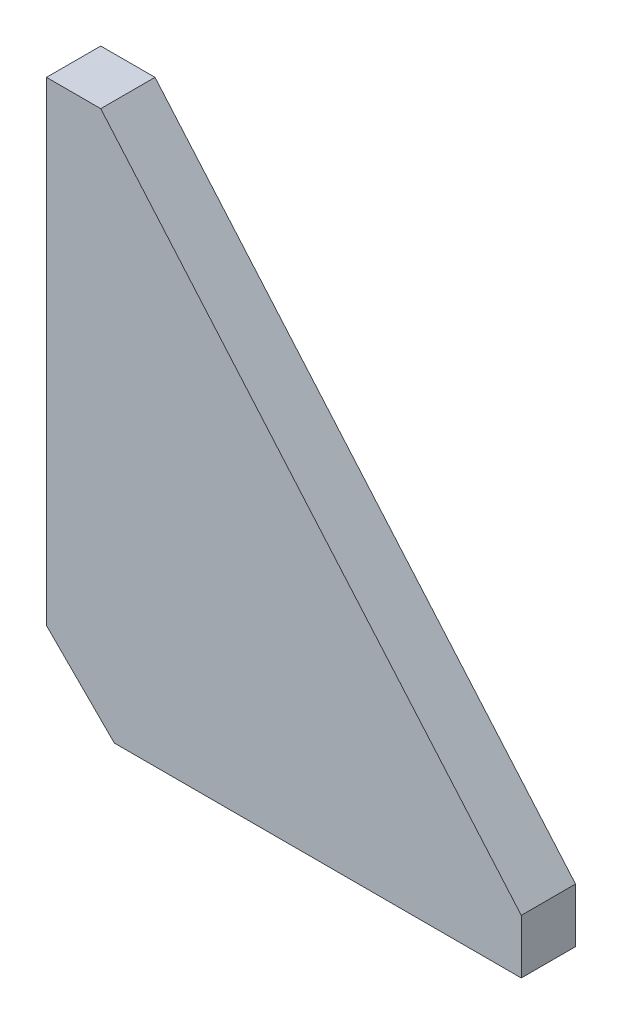
ISO-10303-21;
HEADER;
FILE_DESCRIPTION(('STEP AP214'),'2;1');
FILE_NAME('part.step','',(''),(''),'','','');
FILE_SCHEMA(('AUTOMOTIVE_DESIGN { 1 0 10303 214 1 1 1 1 }'));
ENDSEC;
DATA;
#1=APPLICATION_CONTEXT('core data for automotive mechanical design processes');
#2=APPLICATION_PROTOCOL_DEFINITION('international standard','automotive_design',2000,#1);
#3=PRODUCT_CONTEXT('',#1,'mechanical');
#4=PRODUCT('Part','Part','',(#3));
#5=PRODUCT_RELATED_PRODUCT_CATEGORY('part','',(#4));
#6=PRODUCT_DEFINITION_FORMATION('','',#4);
#7=PRODUCT_DEFINITION_CONTEXT('part definition',#1,'design');
#8=PRODUCT_DEFINITION('design','',#6,#7);
#9=PRODUCT_DEFINITION_SHAPE('','',#8);
#10=(LENGTH_UNIT() NAMED_UNIT(*) SI_UNIT(.MILLI.,.METRE.));
#11=(NAMED_UNIT(*) PLANE_ANGLE_UNIT() SI_UNIT($,.RADIAN.));
#12=(NAMED_UNIT(*) SI_UNIT($,.STERADIAN.) SOLID_ANGLE_UNIT());
#13=UNCERTAINTY_MEASURE_WITH_UNIT(LENGTH_MEASURE(1.E-05),#10,'distance_accuracy_value','');
#14=(GEOMETRIC_REPRESENTATION_CONTEXT(3) GLOBAL_UNCERTAINTY_ASSIGNED_CONTEXT((#13)) GLOBAL_UNIT_ASSIGNED_CONTEXT((#10,
#11,#12)) REPRESENTATION_CONTEXT('',''));
#15=CARTESIAN_POINT('',(0.,0.,0.));
#16=DIRECTION('',(0.,0.,1.));
#17=DIRECTION('',(1.,0.,0.));
#18=AXIS2_PLACEMENT_3D('',#15,#16,#17);
#19=CARTESIAN_POINT('',(70.,0.,4.));
#20=DIRECTION('',(0.,1.,0.));
#21=DIRECTION('',(-1.,0.,0.));
#22=AXIS2_PLACEMENT_3D('',#19,#20,#21);
#23=PLANE('',#22);
#24=DIRECTION('',(1.,0.,0.));
#25=VECTOR('',#24,1.);
#26=CARTESIAN_POINT('',(70.,0.,4.));
#27=LINE('',#26,#25);
#28=CARTESIAN_POINT('',(10.,0.,4.));
#29=VERTEX_POINT('',#28);
#30=CARTESIAN_POINT('',(70.,0.,4.));
#31=VERTEX_POINT('',#30);
#32=EDGE_CURVE('E101',#29,#31,#27,.T.);
#33=ORIENTED_EDGE('',*,*,#32,.F.);
#34=DIRECTION('',(0.,0.,-1.));
#35=VECTOR('',#34,1.);
#36=CARTESIAN_POINT('',(10.,0.,4.));
#37=LINE('',#36,#35);
#38=CARTESIAN_POINT('',(10.,0.,-4.));
#39=VERTEX_POINT('',#38);
#40=EDGE_CURVE('E127',#29,#39,#37,.T.);
#41=ORIENTED_EDGE('',*,*,#40,.T.);
#42=DIRECTION('',(1.,0.,0.));
#43=VECTOR('',#42,1.);
#44=CARTESIAN_POINT('',(70.,0.,-4.));
#45=LINE('',#44,#43);
#46=CARTESIAN_POINT('',(70.,0.,-4.));
#47=VERTEX_POINT('',#46);
#48=EDGE_CURVE('E124',#39,#47,#45,.T.);
#49=ORIENTED_EDGE('',*,*,#48,.T.);
#50=DIRECTION('',(0.,0.,-1.));
#51=VECTOR('',#50,1.);
#52=CARTESIAN_POINT('',(70.,0.,4.));
#53=LINE('',#52,#51);
#54=EDGE_CURVE('E117',#31,#47,#53,.T.);
#55=ORIENTED_EDGE('',*,*,#54,.F.);
#56=EDGE_LOOP('',(#33,#41,#49,#55));
#57=FACE_BOUND('',#56,.T.);
#58=ADVANCED_FACE('F47',(#57),#23,.F.);
#59=CARTESIAN_POINT('',(70.,0.,4.));
#60=DIRECTION('',(-1.,0.,0.));
#61=DIRECTION('',(0.,0.,1.));
#62=AXIS2_PLACEMENT_3D('',#59,#60,#61);
#63=PLANE('',#62);
#64=DIRECTION('',(0.,1.,0.));
#65=VECTOR('',#64,1.);
#66=CARTESIAN_POINT('',(70.,0.,-4.));
#67=LINE('',#66,#65);
#68=CARTESIAN_POINT('',(70.,8.,-4.));
#69=VERTEX_POINT('',#68);
#70=EDGE_CURVE('E159',#47,#69,#67,.T.);
#71=ORIENTED_EDGE('',*,*,#70,.T.);
#72=DIRECTION('',(0.,0.,-1.));
#73=VECTOR('',#72,1.);
#74=CARTESIAN_POINT('',(70.,8.,4.));
#75=LINE('',#74,#73);
#76=CARTESIAN_POINT('',(70.,8.,4.));
#77=VERTEX_POINT('',#76);
#78=EDGE_CURVE('E119',#77,#69,#75,.T.);
#79=ORIENTED_EDGE('',*,*,#78,.F.);
#80=DIRECTION('',(0.,1.,0.));
#81=VECTOR('',#80,1.);
#82=CARTESIAN_POINT('',(70.,0.,4.));
#83=LINE('',#82,#81);
#84=EDGE_CURVE('E104',#31,#77,#83,.T.);
#85=ORIENTED_EDGE('',*,*,#84,.F.);
#86=ORIENTED_EDGE('',*,*,#54,.T.);
#87=EDGE_LOOP('',(#71,#79,#85,#86));
#88=FACE_BOUND('',#87,.T.);
#89=ADVANCED_FACE('F116',(#88),#63,.F.);
#90=CARTESIAN_POINT('',(8.,80.,4.));
#91=DIRECTION('',(-0.757768802353406,-0.652523135359877,0.));
#92=DIRECTION('',(0.652523135359877,-0.757768802353406,0.));
#93=AXIS2_PLACEMENT_3D('',#90,#91,#92);
#94=PLANE('',#93);
#95=DIRECTION('',(-0.652523135359877,0.757768802353406,0.));
#96=VECTOR('',#95,1.);
#97=CARTESIAN_POINT('',(8.,80.,-4.));
#98=LINE('',#97,#96);
#99=CARTESIAN_POINT('',(8.,80.,-4.));
#100=VERTEX_POINT('',#99);
#101=EDGE_CURVE('E156',#69,#100,#98,.T.);
#102=ORIENTED_EDGE('',*,*,#101,.T.);
#103=DIRECTION('',(0.,0.,-1.));
#104=VECTOR('',#103,1.);
#105=CARTESIAN_POINT('',(8.,80.,4.));
#106=LINE('',#105,#104);
#107=CARTESIAN_POINT('',(8.,80.,4.));
#108=VERTEX_POINT('',#107);
#109=EDGE_CURVE('E133',#108,#100,#106,.T.);
#110=ORIENTED_EDGE('',*,*,#109,.F.);
#111=DIRECTION('',(-0.652523135359877,0.757768802353406,0.));
#112=VECTOR('',#111,1.);
#113=CARTESIAN_POINT('',(8.,80.,4.));
#114=LINE('',#113,#112);
#115=EDGE_CURVE('E122',#77,#108,#114,.T.);
#116=ORIENTED_EDGE('',*,*,#115,.F.);
#117=ORIENTED_EDGE('',*,*,#78,.T.);
#118=EDGE_LOOP('',(#102,#110,#116,#117));
#119=FACE_BOUND('',#118,.T.);
#120=ADVANCED_FACE('F175',(#119),#94,.F.);
#121=CARTESIAN_POINT('',(8.,80.,4.));
#122=DIRECTION('',(0.,-1.,0.));
#123=DIRECTION('',(0.,0.,-1.));
#124=AXIS2_PLACEMENT_3D('',#121,#122,#123);
#125=PLANE('',#124);
#126=DIRECTION('',(-1.,0.,0.));
#127=VECTOR('',#126,1.);
#128=CARTESIAN_POINT('',(8.,80.,-4.));
#129=LINE('',#128,#127);
#130=CARTESIAN_POINT('',(0.,80.,-4.));
#131=VERTEX_POINT('',#130);
#132=EDGE_CURVE('E153',#100,#131,#129,.T.);
#133=ORIENTED_EDGE('',*,*,#132,.T.);
#134=DIRECTION('',(0.,0.,-1.));
#135=VECTOR('',#134,1.);
#136=CARTESIAN_POINT('',(0.,80.,4.));
#137=LINE('',#136,#135);
#138=CARTESIAN_POINT('',(0.,80.,4.));
#139=VERTEX_POINT('',#138);
#140=EDGE_CURVE('E146',#139,#131,#137,.T.);
#141=ORIENTED_EDGE('',*,*,#140,.F.);
#142=DIRECTION('',(-1.,0.,0.));
#143=VECTOR('',#142,1.);
#144=CARTESIAN_POINT('',(8.,80.,4.));
#145=LINE('',#144,#143);
#146=EDGE_CURVE('E166',#108,#139,#145,.T.);
#147=ORIENTED_EDGE('',*,*,#146,.F.);
#148=ORIENTED_EDGE('',*,*,#109,.T.);
#149=EDGE_LOOP('',(#133,#141,#147,#148));
#150=FACE_BOUND('',#149,.T.);
#151=ADVANCED_FACE('F179',(#150),#125,.F.);
#152=CARTESIAN_POINT('',(0.,0.,4.));
#153=DIRECTION('',(1.,0.,0.));
#154=DIRECTION('',(0.,0.,-1.));
#155=AXIS2_PLACEMENT_3D('',#152,#153,#154);
#156=PLANE('',#155);
#157=DIRECTION('',(0.,-1.,0.));
#158=VECTOR('',#157,1.);
#159=CARTESIAN_POINT('',(0.,0.,-4.));
#160=LINE('',#159,#158);
#161=CARTESIAN_POINT('',(0.,10.,-4.));
#162=VERTEX_POINT('',#161);
#163=EDGE_CURVE('E112',#131,#162,#160,.T.);
#164=ORIENTED_EDGE('',*,*,#163,.T.);
#165=DIRECTION('',(0.,0.,1.));
#166=VECTOR('',#165,1.);
#167=CARTESIAN_POINT('',(0.,10.,4.));
#168=LINE('',#167,#166);
#169=CARTESIAN_POINT('',(0.,10.,4.));
#170=VERTEX_POINT('',#169);
#171=EDGE_CURVE('E57',#162,#170,#168,.T.);
#172=ORIENTED_EDGE('',*,*,#171,.T.);
#173=DIRECTION('',(0.,-1.,0.));
#174=VECTOR('',#173,1.);
#175=CARTESIAN_POINT('',(0.,0.,4.));
#176=LINE('',#175,#174);
#177=EDGE_CURVE('E150',#139,#170,#176,.T.);
#178=ORIENTED_EDGE('',*,*,#177,.F.);
#179=ORIENTED_EDGE('',*,*,#140,.T.);
#180=EDGE_LOOP('',(#164,#172,#178,#179));
#181=FACE_BOUND('',#180,.T.);
#182=ADVANCED_FACE('F180',(#181),#156,.F.);
#183=CARTESIAN_POINT('',(0.,0.,4.));
#184=DIRECTION('',(0.,0.,-1.));
#185=DIRECTION('',(-1.,0.,0.));
#186=AXIS2_PLACEMENT_3D('',#183,#184,#185);
#187=PLANE('',#186);
#188=ORIENTED_EDGE('',*,*,#177,.T.);
#189=DIRECTION('',(-0.707106781186547,0.707106781186549,0.));
#190=VECTOR('',#189,1.);
#191=CARTESIAN_POINT('',(10.,0.,4.));
#192=LINE('',#191,#190);
#193=EDGE_CURVE('E11',#170,#29,#192,.F.);
#194=ORIENTED_EDGE('',*,*,#193,.T.);
#195=ORIENTED_EDGE('',*,*,#32,.T.);
#196=ORIENTED_EDGE('',*,*,#84,.T.);
#197=ORIENTED_EDGE('',*,*,#115,.T.);
#198=ORIENTED_EDGE('',*,*,#146,.T.);
#199=EDGE_LOOP('',(#188,#194,#195,#196,#197,#198));
#200=FACE_BOUND('',#199,.T.);
#201=ADVANCED_FACE('F103',(#200),#187,.F.);
#202=CARTESIAN_POINT('',(0.,0.,-4.));
#203=DIRECTION('',(0.,0.,-1.));
#204=DIRECTION('',(-1.,0.,0.));
#205=AXIS2_PLACEMENT_3D('',#202,#203,#204);
#206=PLANE('',#205);
#207=ORIENTED_EDGE('',*,*,#48,.F.);
#208=DIRECTION('',(0.707106781186547,-0.707106781186549,0.));
#209=VECTOR('',#208,1.);
#210=CARTESIAN_POINT('',(5.00000000000002,5.00000000000001,-4.));
#211=LINE('',#210,#209);
#212=EDGE_CURVE('E71',#39,#162,#211,.F.);
#213=ORIENTED_EDGE('',*,*,#212,.T.);
#214=ORIENTED_EDGE('',*,*,#163,.F.);
#215=ORIENTED_EDGE('',*,*,#132,.F.);
#216=ORIENTED_EDGE('',*,*,#101,.F.);
#217=ORIENTED_EDGE('',*,*,#70,.F.);
#218=EDGE_LOOP('',(#207,#213,#214,#215,#216,#217));
#219=FACE_BOUND('',#218,.T.);
#220=ADVANCED_FACE('F182',(#219),#206,.T.);
#221=CARTESIAN_POINT('',(10.,0.,4.));
#222=DIRECTION('',(0.707106781186549,0.707106781186547,0.));
#223=DIRECTION('',(0.,0.,-1.));
#224=AXIS2_PLACEMENT_3D('',#221,#222,#223);
#225=PLANE('',#224);
#226=ORIENTED_EDGE('',*,*,#193,.F.);
#227=ORIENTED_EDGE('',*,*,#171,.F.);
#228=ORIENTED_EDGE('',*,*,#212,.F.);
#229=ORIENTED_EDGE('',*,*,#40,.F.);
#230=EDGE_LOOP('',(#226,#227,#228,#229));
#231=FACE_BOUND('',#230,.T.);
#232=ADVANCED_FACE('F50',(#231),#225,.F.);
#233=CLOSED_SHELL('',(#58,#89,#120,#151,#182,#201,#220,#232));
#234=MANIFOLD_SOLID_BREP('B2',#233);
#235=ADVANCED_BREP_SHAPE_REPRESENTATION('',(#18,#234),#14);
#236=SHAPE_DEFINITION_REPRESENTATION(#9,#235);
ENDSEC;
END-ISO-10303-21;
